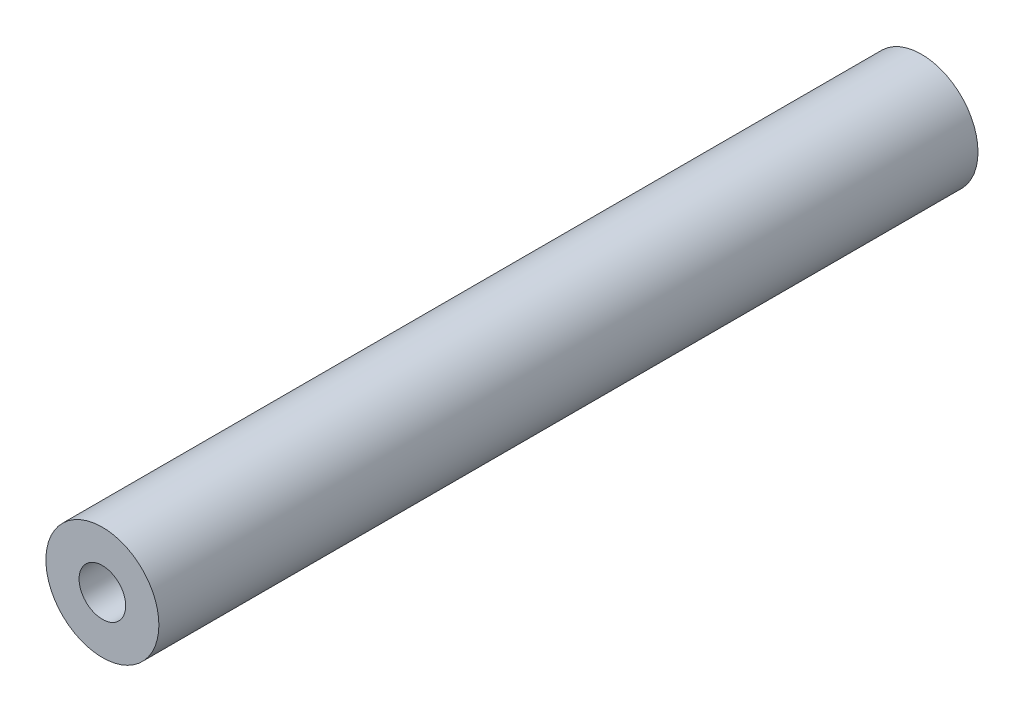
ISO-10303-21;
HEADER;
FILE_DESCRIPTION(('STEP AP214'),'2;1');
FILE_NAME('part.step','',(''),(''),'','','');
FILE_SCHEMA(('AUTOMOTIVE_DESIGN { 1 0 10303 214 1 1 1 1 }'));
ENDSEC;
DATA;
#1=APPLICATION_CONTEXT('core data for automotive mechanical design processes');
#2=APPLICATION_PROTOCOL_DEFINITION('international standard','automotive_design',2000,#1);
#3=PRODUCT_CONTEXT('',#1,'mechanical');
#4=PRODUCT('Part','Part','',(#3));
#5=PRODUCT_RELATED_PRODUCT_CATEGORY('part','',(#4));
#6=PRODUCT_DEFINITION_FORMATION('','',#4);
#7=PRODUCT_DEFINITION_CONTEXT('part definition',#1,'design');
#8=PRODUCT_DEFINITION('design','',#6,#7);
#9=PRODUCT_DEFINITION_SHAPE('','',#8);
#10=(LENGTH_UNIT() NAMED_UNIT(*) SI_UNIT(.MILLI.,.METRE.));
#11=(NAMED_UNIT(*) PLANE_ANGLE_UNIT() SI_UNIT($,.RADIAN.));
#12=(NAMED_UNIT(*) SI_UNIT($,.STERADIAN.) SOLID_ANGLE_UNIT());
#13=UNCERTAINTY_MEASURE_WITH_UNIT(LENGTH_MEASURE(1.E-05),#10,'distance_accuracy_value','');
#14=(GEOMETRIC_REPRESENTATION_CONTEXT(3) GLOBAL_UNCERTAINTY_ASSIGNED_CONTEXT((#13)) GLOBAL_UNIT_ASSIGNED_CONTEXT((#10,
#11,#12)) REPRESENTATION_CONTEXT('',''));
#15=CARTESIAN_POINT('',(0.,0.,0.));
#16=DIRECTION('',(0.,0.,1.));
#17=DIRECTION('',(1.,0.,0.));
#18=AXIS2_PLACEMENT_3D('',#15,#16,#17);
#19=CARTESIAN_POINT('',(0.,0.,0.));
#20=DIRECTION('',(0.,0.,1.));
#21=DIRECTION('',(1.,0.,0.));
#22=AXIS2_PLACEMENT_3D('',#19,#20,#21);
#23=CYLINDRICAL_SURFACE('',#22,1.65);
#24=CARTESIAN_POINT('',(0.,0.,17.4));
#25=DIRECTION('',(0.,0.,1.));
#26=DIRECTION('',(1.,0.,0.));
#27=AXIS2_PLACEMENT_3D('',#24,#25,#26);
#28=CIRCLE('',#27,1.65);
#29=CARTESIAN_POINT('',(1.65,0.,17.4));
#30=VERTEX_POINT('',#29);
#31=EDGE_CURVE('E54',#30,#30,#28,.T.);
#32=ORIENTED_EDGE('',*,*,#31,.T.);
#33=EDGE_LOOP('',(#32));
#34=FACE_BOUND('',#33,.T.);
#35=CARTESIAN_POINT('',(0.,0.,0.));
#36=DIRECTION('',(0.,0.,1.));
#37=DIRECTION('',(1.,0.,0.));
#38=AXIS2_PLACEMENT_3D('',#35,#36,#37);
#39=CIRCLE('',#38,1.64999999999999);
#40=CARTESIAN_POINT('',(1.64999999999999,0.,0.));
#41=VERTEX_POINT('',#40);
#42=EDGE_CURVE('E10',#41,#41,#39,.T.);
#43=ORIENTED_EDGE('',*,*,#42,.F.);
#44=EDGE_LOOP('',(#43));
#45=FACE_BOUND('',#44,.T.);
#46=ADVANCED_FACE('F32',(#34,#45),#23,.F.);
#47=CARTESIAN_POINT('',(4.,0.,0.));
#48=DIRECTION('',(0.,0.,-1.));
#49=DIRECTION('',(-1.,0.,0.));
#50=AXIS2_PLACEMENT_3D('',#47,#48,#49);
#51=PLANE('',#50);
#52=ORIENTED_EDGE('',*,*,#42,.T.);
#53=EDGE_LOOP('',(#52));
#54=FACE_BOUND('',#53,.T.);
#55=CARTESIAN_POINT('',(0.,0.,0.));
#56=DIRECTION('',(0.,0.,1.));
#57=DIRECTION('',(1.,0.,0.));
#58=AXIS2_PLACEMENT_3D('',#55,#56,#57);
#59=CIRCLE('',#58,4.);
#60=CARTESIAN_POINT('',(4.,0.,0.));
#61=VERTEX_POINT('',#60);
#62=EDGE_CURVE('E38',#61,#61,#59,.T.);
#63=ORIENTED_EDGE('',*,*,#62,.F.);
#64=EDGE_LOOP('',(#63));
#65=FACE_BOUND('',#64,.T.);
#66=ADVANCED_FACE('F71',(#54,#65),#51,.T.);
#67=CARTESIAN_POINT('',(0.,0.,0.));
#68=DIRECTION('',(0.,0.,1.));
#69=DIRECTION('',(1.,0.,0.));
#70=AXIS2_PLACEMENT_3D('',#67,#68,#69);
#71=CYLINDRICAL_SURFACE('',#70,4.);
#72=ORIENTED_EDGE('',*,*,#62,.T.);
#73=EDGE_LOOP('',(#72));
#74=FACE_BOUND('',#73,.T.);
#75=CARTESIAN_POINT('',(0.,0.,58.));
#76=DIRECTION('',(0.,0.,1.));
#77=DIRECTION('',(1.,0.,0.));
#78=AXIS2_PLACEMENT_3D('',#75,#76,#77);
#79=CIRCLE('',#78,4.);
#80=CARTESIAN_POINT('',(4.,0.,58.));
#81=VERTEX_POINT('',#80);
#82=EDGE_CURVE('E42',#81,#81,#79,.T.);
#83=ORIENTED_EDGE('',*,*,#82,.F.);
#84=EDGE_LOOP('',(#83));
#85=FACE_BOUND('',#84,.T.);
#86=ADVANCED_FACE('F75',(#74,#85),#71,.T.);
#87=CARTESIAN_POINT('',(1.65,0.,58.));
#88=DIRECTION('',(0.,0.,1.));
#89=DIRECTION('',(1.,0.,0.));
#90=AXIS2_PLACEMENT_3D('',#87,#88,#89);
#91=PLANE('',#90);
#92=ORIENTED_EDGE('',*,*,#82,.T.);
#93=EDGE_LOOP('',(#92));
#94=FACE_BOUND('',#93,.T.);
#95=CARTESIAN_POINT('',(0.,0.,58.));
#96=DIRECTION('',(0.,0.,1.));
#97=DIRECTION('',(1.,0.,0.));
#98=AXIS2_PLACEMENT_3D('',#95,#96,#97);
#99=CIRCLE('',#98,1.65);
#100=CARTESIAN_POINT('',(1.65,0.,58.));
#101=VERTEX_POINT('',#100);
#102=EDGE_CURVE('E46',#101,#101,#99,.T.);
#103=ORIENTED_EDGE('',*,*,#102,.F.);
#104=EDGE_LOOP('',(#103));
#105=FACE_BOUND('',#104,.T.);
#106=ADVANCED_FACE('F79',(#94,#105),#91,.T.);
#107=CARTESIAN_POINT('',(0.,0.,0.));
#108=DIRECTION('',(0.,0.,1.));
#109=DIRECTION('',(1.,0.,0.));
#110=AXIS2_PLACEMENT_3D('',#107,#108,#109);
#111=CYLINDRICAL_SURFACE('',#110,1.65);
#112=ORIENTED_EDGE('',*,*,#102,.T.);
#113=EDGE_LOOP('',(#112));
#114=FACE_BOUND('',#113,.T.);
#115=CARTESIAN_POINT('',(0.,0.,40.6));
#116=DIRECTION('',(0.,0.,1.));
#117=DIRECTION('',(1.,0.,0.));
#118=AXIS2_PLACEMENT_3D('',#115,#116,#117);
#119=CIRCLE('',#118,1.65);
#120=CARTESIAN_POINT('',(1.65,0.,40.6));
#121=VERTEX_POINT('',#120);
#122=EDGE_CURVE('E51',#121,#121,#119,.T.);
#123=ORIENTED_EDGE('',*,*,#122,.F.);
#124=EDGE_LOOP('',(#123));
#125=FACE_BOUND('',#124,.T.);
#126=ADVANCED_FACE('F67',(#114,#125),#111,.F.);
#127=CARTESIAN_POINT('',(0.,0.,40.6));
#128=DIRECTION('',(0.,0.,1.));
#129=DIRECTION('',(1.,0.,0.));
#130=AXIS2_PLACEMENT_3D('',#127,#128,#129);
#131=PLANE('',#130);
#132=ORIENTED_EDGE('',*,*,#122,.T.);
#133=EDGE_LOOP('',(#132));
#134=FACE_BOUND('',#133,.T.);
#135=ADVANCED_FACE('F62',(#134),#131,.T.);
#136=CARTESIAN_POINT('',(1.65,0.,17.4));
#137=DIRECTION('',(0.,0.,-1.));
#138=DIRECTION('',(-1.,0.,0.));
#139=AXIS2_PLACEMENT_3D('',#136,#137,#138);
#140=PLANE('',#139);
#141=ORIENTED_EDGE('',*,*,#31,.F.);
#142=EDGE_LOOP('',(#141));
#143=FACE_BOUND('',#142,.T.);
#144=ADVANCED_FACE('F60',(#143),#140,.T.);
#145=CLOSED_SHELL('',(#46,#66,#86,#106,#126,#135,#144));
#146=MANIFOLD_SOLID_BREP('B2',#145);
#147=ADVANCED_BREP_SHAPE_REPRESENTATION('',(#18,#146),#14);
#148=SHAPE_DEFINITION_REPRESENTATION(#9,#147);
ENDSEC;
END-ISO-10303-21;
